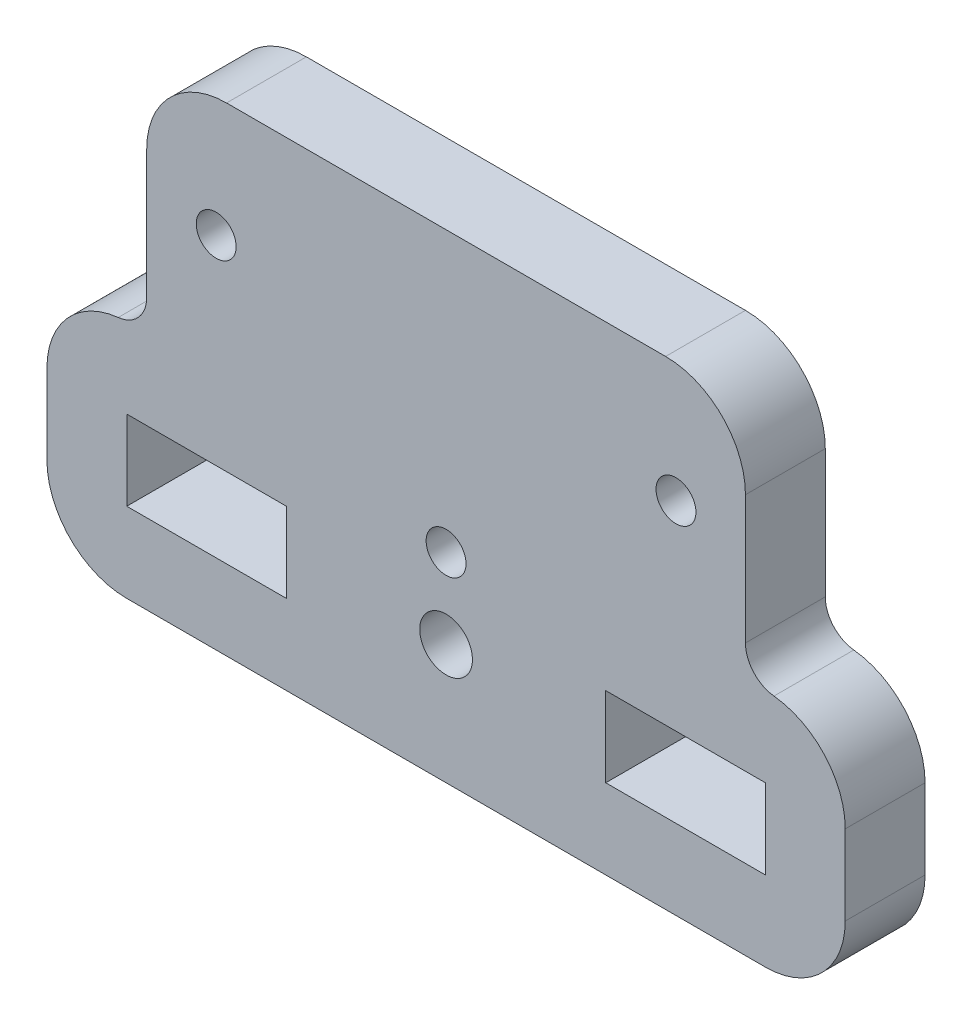
ISO-10303-21;
HEADER;
FILE_DESCRIPTION(('STEP AP214'),'2;1');
FILE_NAME('part.step','',(''),(''),'','','');
FILE_SCHEMA(('AUTOMOTIVE_DESIGN { 1 0 10303 214 1 1 1 1 }'));
ENDSEC;
DATA;
#1=APPLICATION_CONTEXT('core data for automotive mechanical design processes');
#2=APPLICATION_PROTOCOL_DEFINITION('international standard','automotive_design',2000,#1);
#3=PRODUCT_CONTEXT('',#1,'mechanical');
#4=PRODUCT('Part','Part','',(#3));
#5=PRODUCT_RELATED_PRODUCT_CATEGORY('part','',(#4));
#6=PRODUCT_DEFINITION_FORMATION('','',#4);
#7=PRODUCT_DEFINITION_CONTEXT('part definition',#1,'design');
#8=PRODUCT_DEFINITION('design','',#6,#7);
#9=PRODUCT_DEFINITION_SHAPE('','',#8);
#10=(LENGTH_UNIT() NAMED_UNIT(*) SI_UNIT(.MILLI.,.METRE.));
#11=(NAMED_UNIT(*) PLANE_ANGLE_UNIT() SI_UNIT($,.RADIAN.));
#12=(NAMED_UNIT(*) SI_UNIT($,.STERADIAN.) SOLID_ANGLE_UNIT());
#13=UNCERTAINTY_MEASURE_WITH_UNIT(LENGTH_MEASURE(1.E-05),#10,'distance_accuracy_value','');
#14=(GEOMETRIC_REPRESENTATION_CONTEXT(3) GLOBAL_UNCERTAINTY_ASSIGNED_CONTEXT((#13)) GLOBAL_UNIT_ASSIGNED_CONTEXT((#10,
#11,#12)) REPRESENTATION_CONTEXT('',''));
#15=CARTESIAN_POINT('',(0.,0.,0.));
#16=DIRECTION('',(0.,0.,1.));
#17=DIRECTION('',(1.,0.,0.));
#18=AXIS2_PLACEMENT_3D('',#15,#16,#17);
#19=CARTESIAN_POINT('',(0.,0.,6.35));
#20=DIRECTION('',(0.,0.,-1.));
#21=DIRECTION('',(-1.,0.,0.));
#22=AXIS2_PLACEMENT_3D('',#19,#20,#21);
#23=PLANE('',#22);
#24=CARTESIAN_POINT('',(0.,6.34999999999999,6.35));
#25=DIRECTION('',(0.,0.,1.));
#26=DIRECTION('',(1.,0.,0.));
#27=AXIS2_PLACEMENT_3D('',#24,#25,#26);
#28=CIRCLE('',#27,1.5875);
#29=CARTESIAN_POINT('',(1.5875,6.34999999999999,6.35));
#30=VERTEX_POINT('',#29);
#31=EDGE_CURVE('E687',#30,#30,#28,.T.);
#32=ORIENTED_EDGE('',*,*,#31,.F.);
#33=EDGE_LOOP('',(#32));
#34=FACE_BOUND('',#33,.T.);
#35=CARTESIAN_POINT('',(18.288,19.05,6.35));
#36=DIRECTION('',(0.,0.,-1.));
#37=DIRECTION('',(-1.,0.,0.));
#38=AXIS2_PLACEMENT_3D('',#35,#36,#37);
#39=CIRCLE('',#38,1.5875);
#40=CARTESIAN_POINT('',(16.7005,19.05,6.35));
#41=VERTEX_POINT('',#40);
#42=EDGE_CURVE('E689',#41,#41,#39,.T.);
#43=ORIENTED_EDGE('',*,*,#42,.T.);
#44=EDGE_LOOP('',(#43));
#45=FACE_BOUND('',#44,.T.);
#46=CARTESIAN_POINT('',(-18.288,19.05,6.35));
#47=DIRECTION('',(0.,0.,1.));
#48=DIRECTION('',(1.,0.,0.));
#49=AXIS2_PLACEMENT_3D('',#46,#47,#48);
#50=CIRCLE('',#49,1.5875);
#51=CARTESIAN_POINT('',(-16.7005,19.05,6.35));
#52=VERTEX_POINT('',#51);
#53=EDGE_CURVE('E694',#52,#52,#50,.T.);
#54=ORIENTED_EDGE('',*,*,#53,.F.);
#55=EDGE_LOOP('',(#54));
#56=FACE_BOUND('',#55,.T.);
#57=CARTESIAN_POINT('',(25.4,3.175,6.35));
#58=DIRECTION('',(0.,0.,-1.));
#59=DIRECTION('',(-1.,0.,0.));
#60=AXIS2_PLACEMENT_3D('',#57,#58,#59);
#61=CIRCLE('',#60,6.35);
#62=CARTESIAN_POINT('',(31.75,3.175,6.35));
#63=VERTEX_POINT('',#62);
#64=CARTESIAN_POINT('',(26.0803571428571,9.48844708999476,6.35));
#65=VERTEX_POINT('',#64);
#66=EDGE_CURVE('E366',#63,#65,#61,.F.);
#67=ORIENTED_EDGE('',*,*,#66,.T.);
#68=CARTESIAN_POINT('',(26.3525,12.0138259259927,6.35));
#69=DIRECTION('',(0.,0.,-1.));
#70=DIRECTION('',(-1.,0.,0.));
#71=AXIS2_PLACEMENT_3D('',#68,#69,#70);
#72=CIRCLE('',#71,2.54);
#73=CARTESIAN_POINT('',(23.8125,12.0138259259927,6.35));
#74=VERTEX_POINT('',#73);
#75=EDGE_CURVE('E301',#65,#74,#72,.T.);
#76=ORIENTED_EDGE('',*,*,#75,.T.);
#77=DIRECTION('',(0.,1.,0.));
#78=VECTOR('',#77,1.);
#79=CARTESIAN_POINT('',(23.8125,28.575,6.35));
#80=LINE('',#79,#78);
#81=CARTESIAN_POINT('',(23.8125,22.225,6.35));
#82=VERTEX_POINT('',#81);
#83=EDGE_CURVE('E288',#74,#82,#80,.T.);
#84=ORIENTED_EDGE('',*,*,#83,.T.);
#85=CARTESIAN_POINT('',(17.4625,22.225,6.35));
#86=DIRECTION('',(0.,0.,-1.));
#87=DIRECTION('',(-1.,0.,0.));
#88=AXIS2_PLACEMENT_3D('',#85,#86,#87);
#89=CIRCLE('',#88,6.35);
#90=CARTESIAN_POINT('',(17.4625,28.575,6.35));
#91=VERTEX_POINT('',#90);
#92=EDGE_CURVE('E376',#82,#91,#89,.F.);
#93=ORIENTED_EDGE('',*,*,#92,.T.);
#94=DIRECTION('',(-1.,0.,0.));
#95=VECTOR('',#94,1.);
#96=CARTESIAN_POINT('',(-23.8125,28.575,6.35));
#97=LINE('',#96,#95);
#98=CARTESIAN_POINT('',(-17.4625,28.575,6.35));
#99=VERTEX_POINT('',#98);
#100=EDGE_CURVE('E291',#91,#99,#97,.T.);
#101=ORIENTED_EDGE('',*,*,#100,.T.);
#102=CARTESIAN_POINT('',(-17.4625,22.225,6.35));
#103=DIRECTION('',(0.,0.,-1.));
#104=DIRECTION('',(-1.,0.,0.));
#105=AXIS2_PLACEMENT_3D('',#102,#103,#104);
#106=CIRCLE('',#105,6.35);
#107=CARTESIAN_POINT('',(-23.8125,22.225,6.35));
#108=VERTEX_POINT('',#107);
#109=EDGE_CURVE('E374',#99,#108,#106,.F.);
#110=ORIENTED_EDGE('',*,*,#109,.T.);
#111=DIRECTION('',(0.,-1.,0.));
#112=VECTOR('',#111,1.);
#113=CARTESIAN_POINT('',(-23.8125,28.575,6.35));
#114=LINE('',#113,#112);
#115=CARTESIAN_POINT('',(-23.8125,12.0138259259927,6.35));
#116=VERTEX_POINT('',#115);
#117=EDGE_CURVE('E362',#108,#116,#114,.T.);
#118=ORIENTED_EDGE('',*,*,#117,.T.);
#119=CARTESIAN_POINT('',(-26.3525,12.0138259259927,6.35));
#120=DIRECTION('',(0.,0.,-1.));
#121=DIRECTION('',(-1.,0.,0.));
#122=AXIS2_PLACEMENT_3D('',#119,#120,#121);
#123=CIRCLE('',#122,2.54);
#124=CARTESIAN_POINT('',(-26.0803571428571,9.48844708999476,6.35));
#125=VERTEX_POINT('',#124);
#126=EDGE_CURVE('E41',#116,#125,#123,.T.);
#127=ORIENTED_EDGE('',*,*,#126,.T.);
#128=CARTESIAN_POINT('',(-25.4,3.175,6.35));
#129=DIRECTION('',(0.,0.,-1.));
#130=DIRECTION('',(-1.,0.,0.));
#131=AXIS2_PLACEMENT_3D('',#128,#129,#130);
#132=CIRCLE('',#131,6.35);
#133=CARTESIAN_POINT('',(-31.75,3.175,6.35));
#134=VERTEX_POINT('',#133);
#135=EDGE_CURVE('E368',#125,#134,#132,.F.);
#136=ORIENTED_EDGE('',*,*,#135,.T.);
#137=DIRECTION('',(0.,-1.,0.));
#138=VECTOR('',#137,1.);
#139=CARTESIAN_POINT('',(-31.75,-9.525,6.35));
#140=LINE('',#139,#138);
#141=CARTESIAN_POINT('',(-31.75,-3.175,6.35));
#142=VERTEX_POINT('',#141);
#143=EDGE_CURVE('E268',#134,#142,#140,.T.);
#144=ORIENTED_EDGE('',*,*,#143,.T.);
#145=CARTESIAN_POINT('',(-25.4,-3.175,6.35));
#146=DIRECTION('',(0.,0.,-1.));
#147=DIRECTION('',(-1.,0.,0.));
#148=AXIS2_PLACEMENT_3D('',#145,#146,#147);
#149=CIRCLE('',#148,6.35);
#150=CARTESIAN_POINT('',(-25.4,-9.525,6.35));
#151=VERTEX_POINT('',#150);
#152=EDGE_CURVE('E370',#142,#151,#149,.F.);
#153=ORIENTED_EDGE('',*,*,#152,.T.);
#154=DIRECTION('',(1.,0.,0.));
#155=VECTOR('',#154,1.);
#156=CARTESIAN_POINT('',(-31.75,-9.525,6.35));
#157=LINE('',#156,#155);
#158=CARTESIAN_POINT('',(25.4,-9.525,6.35));
#159=VERTEX_POINT('',#158);
#160=EDGE_CURVE('E272',#151,#159,#157,.T.);
#161=ORIENTED_EDGE('',*,*,#160,.T.);
#162=CARTESIAN_POINT('',(25.4,-3.175,6.35));
#163=DIRECTION('',(0.,0.,-1.));
#164=DIRECTION('',(-1.,0.,0.));
#165=AXIS2_PLACEMENT_3D('',#162,#163,#164);
#166=CIRCLE('',#165,6.35);
#167=CARTESIAN_POINT('',(31.75,-3.175,6.35));
#168=VERTEX_POINT('',#167);
#169=EDGE_CURVE('E372',#159,#168,#166,.F.);
#170=ORIENTED_EDGE('',*,*,#169,.T.);
#171=DIRECTION('',(0.,1.,0.));
#172=VECTOR('',#171,1.);
#173=CARTESIAN_POINT('',(31.75,-9.525,6.35));
#174=LINE('',#173,#172);
#175=EDGE_CURVE('E265',#168,#63,#174,.T.);
#176=ORIENTED_EDGE('',*,*,#175,.T.);
#177=EDGE_LOOP('',(#67,#76,#84,#93,#101,#110,#118,#127,#136,#144,#153,#161,#170,#176));
#178=FACE_BOUND('',#177,.T.);
#179=CARTESIAN_POINT('',(0.,0.,6.35));
#180=DIRECTION('',(0.,0.,1.));
#181=DIRECTION('',(1.,0.,0.));
#182=AXIS2_PLACEMENT_3D('',#179,#180,#181);
#183=CIRCLE('',#182,2.0955);
#184=CARTESIAN_POINT('',(2.0955,0.,6.35));
#185=VERTEX_POINT('',#184);
#186=EDGE_CURVE('E252',#185,#185,#183,.T.);
#187=ORIENTED_EDGE('',*,*,#186,.F.);
#188=EDGE_LOOP('',(#187));
#189=FACE_BOUND('',#188,.T.);
#190=DIRECTION('',(-1.,0.,0.));
#191=VECTOR('',#190,1.);
#192=CARTESIAN_POINT('',(-25.4,3.17499999999999,6.35));
#193=LINE('',#192,#191);
#194=CARTESIAN_POINT('',(-12.7,3.17499999999999,6.35));
#195=VERTEX_POINT('',#194);
#196=CARTESIAN_POINT('',(-25.4,3.17499999999999,6.35));
#197=VERTEX_POINT('',#196);
#198=EDGE_CURVE('E242',#195,#197,#193,.T.);
#199=ORIENTED_EDGE('',*,*,#198,.F.);
#200=DIRECTION('',(0.,1.,0.));
#201=VECTOR('',#200,1.);
#202=CARTESIAN_POINT('',(-12.7,-3.17500000000001,6.35));
#203=LINE('',#202,#201);
#204=CARTESIAN_POINT('',(-12.7,-3.17500000000001,6.35));
#205=VERTEX_POINT('',#204);
#206=EDGE_CURVE('E223',#205,#195,#203,.T.);
#207=ORIENTED_EDGE('',*,*,#206,.F.);
#208=DIRECTION('',(1.,0.,0.));
#209=VECTOR('',#208,1.);
#210=CARTESIAN_POINT('',(-25.4,-3.17500000000001,6.35));
#211=LINE('',#210,#209);
#212=CARTESIAN_POINT('',(-25.4,-3.17500000000001,6.35));
#213=VERTEX_POINT('',#212);
#214=EDGE_CURVE('E231',#213,#205,#211,.T.);
#215=ORIENTED_EDGE('',*,*,#214,.F.);
#216=DIRECTION('',(0.,-1.,0.));
#217=VECTOR('',#216,1.);
#218=CARTESIAN_POINT('',(-25.4,-3.17500000000001,6.35));
#219=LINE('',#218,#217);
#220=EDGE_CURVE('E245',#197,#213,#219,.T.);
#221=ORIENTED_EDGE('',*,*,#220,.F.);
#222=EDGE_LOOP('',(#199,#207,#215,#221));
#223=FACE_BOUND('',#222,.T.);
#224=DIRECTION('',(0.,1.,0.));
#225=VECTOR('',#224,1.);
#226=CARTESIAN_POINT('',(12.7,-3.17500000000001,6.35));
#227=LINE('',#226,#225);
#228=CARTESIAN_POINT('',(12.7,-3.17500000000001,6.35));
#229=VERTEX_POINT('',#228);
#230=CARTESIAN_POINT('',(12.7,3.17499999999999,6.35));
#231=VERTEX_POINT('',#230);
#232=EDGE_CURVE('E199',#229,#231,#227,.T.);
#233=ORIENTED_EDGE('',*,*,#232,.T.);
#234=DIRECTION('',(1.,0.,0.));
#235=VECTOR('',#234,1.);
#236=CARTESIAN_POINT('',(25.4,3.17499999999999,6.35));
#237=LINE('',#236,#235);
#238=CARTESIAN_POINT('',(25.4,3.17499999999999,6.35));
#239=VERTEX_POINT('',#238);
#240=EDGE_CURVE('E204',#231,#239,#237,.T.);
#241=ORIENTED_EDGE('',*,*,#240,.T.);
#242=DIRECTION('',(0.,-1.,0.));
#243=VECTOR('',#242,1.);
#244=CARTESIAN_POINT('',(25.4,-3.17500000000001,6.35));
#245=LINE('',#244,#243);
#246=CARTESIAN_POINT('',(25.4,-3.17500000000001,6.35));
#247=VERTEX_POINT('',#246);
#248=EDGE_CURVE('E207',#239,#247,#245,.T.);
#249=ORIENTED_EDGE('',*,*,#248,.T.);
#250=DIRECTION('',(-1.,0.,0.));
#251=VECTOR('',#250,1.);
#252=CARTESIAN_POINT('',(25.4,-3.17500000000001,6.35));
#253=LINE('',#252,#251);
#254=EDGE_CURVE('E216',#247,#229,#253,.T.);
#255=ORIENTED_EDGE('',*,*,#254,.T.);
#256=EDGE_LOOP('',(#233,#241,#249,#255));
#257=FACE_BOUND('',#256,.T.);
#258=ADVANCED_FACE('F33',(#34,#45,#56,#178,#189,#223,#257),#23,.F.);
#259=CARTESIAN_POINT('',(0.,0.,0.));
#260=DIRECTION('',(0.,0.,-1.));
#261=DIRECTION('',(-1.,0.,0.));
#262=AXIS2_PLACEMENT_3D('',#259,#260,#261);
#263=PLANE('',#262);
#264=CARTESIAN_POINT('',(0.,6.34999999999999,0.));
#265=DIRECTION('',(0.,0.,-1.));
#266=DIRECTION('',(-1.,0.,0.));
#267=AXIS2_PLACEMENT_3D('',#264,#265,#266);
#268=CIRCLE('',#267,1.5875);
#269=CARTESIAN_POINT('',(-1.5875,6.34999999999999,0.));
#270=VERTEX_POINT('',#269);
#271=EDGE_CURVE('E685',#270,#270,#268,.T.);
#272=ORIENTED_EDGE('',*,*,#271,.F.);
#273=EDGE_LOOP('',(#272));
#274=FACE_BOUND('',#273,.T.);
#275=CARTESIAN_POINT('',(18.288,19.05,0.));
#276=DIRECTION('',(0.,0.,-1.));
#277=DIRECTION('',(-1.,0.,0.));
#278=AXIS2_PLACEMENT_3D('',#275,#276,#277);
#279=CIRCLE('',#278,1.5875);
#280=CARTESIAN_POINT('',(16.7005,19.05,0.));
#281=VERTEX_POINT('',#280);
#282=EDGE_CURVE('E693',#281,#281,#279,.F.);
#283=ORIENTED_EDGE('',*,*,#282,.T.);
#284=EDGE_LOOP('',(#283));
#285=FACE_BOUND('',#284,.T.);
#286=CARTESIAN_POINT('',(-18.288,19.05,0.));
#287=DIRECTION('',(0.,0.,-1.));
#288=DIRECTION('',(-1.,0.,0.));
#289=AXIS2_PLACEMENT_3D('',#286,#287,#288);
#290=CIRCLE('',#289,1.5875);
#291=CARTESIAN_POINT('',(-19.8755,19.05,0.));
#292=VERTEX_POINT('',#291);
#293=EDGE_CURVE('E292',#292,#292,#290,.T.);
#294=ORIENTED_EDGE('',*,*,#293,.F.);
#295=EDGE_LOOP('',(#294));
#296=FACE_BOUND('',#295,.T.);
#297=DIRECTION('',(0.,1.,0.));
#298=VECTOR('',#297,1.);
#299=CARTESIAN_POINT('',(-12.7,-3.17500000000001,0.));
#300=LINE('',#299,#298);
#301=CARTESIAN_POINT('',(-12.7,-3.17500000000001,0.));
#302=VERTEX_POINT('',#301);
#303=CARTESIAN_POINT('',(-12.7,3.17499999999999,0.));
#304=VERTEX_POINT('',#303);
#305=EDGE_CURVE('E227',#302,#304,#300,.T.);
#306=ORIENTED_EDGE('',*,*,#305,.T.);
#307=DIRECTION('',(-1.,0.,0.));
#308=VECTOR('',#307,1.);
#309=CARTESIAN_POINT('',(-25.4,3.17499999999999,0.));
#310=LINE('',#309,#308);
#311=CARTESIAN_POINT('',(-25.4,3.17499999999999,0.));
#312=VERTEX_POINT('',#311);
#313=EDGE_CURVE('E230',#304,#312,#310,.T.);
#314=ORIENTED_EDGE('',*,*,#313,.T.);
#315=DIRECTION('',(0.,-1.,0.));
#316=VECTOR('',#315,1.);
#317=CARTESIAN_POINT('',(-25.4,-3.17500000000001,0.));
#318=LINE('',#317,#316);
#319=CARTESIAN_POINT('',(-25.4,-3.17500000000001,0.));
#320=VERTEX_POINT('',#319);
#321=EDGE_CURVE('E234',#312,#320,#318,.T.);
#322=ORIENTED_EDGE('',*,*,#321,.T.);
#323=DIRECTION('',(1.,0.,0.));
#324=VECTOR('',#323,1.);
#325=CARTESIAN_POINT('',(-25.4,-3.17500000000001,0.));
#326=LINE('',#325,#324);
#327=EDGE_CURVE('E237',#320,#302,#326,.T.);
#328=ORIENTED_EDGE('',*,*,#327,.T.);
#329=EDGE_LOOP('',(#306,#314,#322,#328));
#330=FACE_BOUND('',#329,.T.);
#331=CARTESIAN_POINT('',(0.,0.,0.));
#332=DIRECTION('',(0.,0.,1.));
#333=DIRECTION('',(1.,0.,0.));
#334=AXIS2_PLACEMENT_3D('',#331,#332,#333);
#335=CIRCLE('',#334,2.0955);
#336=CARTESIAN_POINT('',(2.0955,0.,0.));
#337=VERTEX_POINT('',#336);
#338=EDGE_CURVE('E259',#337,#337,#335,.T.);
#339=ORIENTED_EDGE('',*,*,#338,.T.);
#340=EDGE_LOOP('',(#339));
#341=FACE_BOUND('',#340,.T.);
#342=DIRECTION('',(-1.,0.,0.));
#343=VECTOR('',#342,1.);
#344=CARTESIAN_POINT('',(-23.8125,28.575,0.));
#345=LINE('',#344,#343);
#346=CARTESIAN_POINT('',(17.4625,28.575,0.));
#347=VERTEX_POINT('',#346);
#348=CARTESIAN_POINT('',(-17.4625,28.575,0.));
#349=VERTEX_POINT('',#348);
#350=EDGE_CURVE('E210',#347,#349,#345,.T.);
#351=ORIENTED_EDGE('',*,*,#350,.F.);
#352=CARTESIAN_POINT('',(17.4625,22.225,0.));
#353=DIRECTION('',(0.,0.,-1.));
#354=DIRECTION('',(-1.,0.,0.));
#355=AXIS2_PLACEMENT_3D('',#352,#353,#354);
#356=CIRCLE('',#355,6.35);
#357=CARTESIAN_POINT('',(23.8125,22.225,0.));
#358=VERTEX_POINT('',#357);
#359=EDGE_CURVE('E343',#347,#358,#356,.T.);
#360=ORIENTED_EDGE('',*,*,#359,.T.);
#361=DIRECTION('',(0.,1.,0.));
#362=VECTOR('',#361,1.);
#363=CARTESIAN_POINT('',(23.8125,28.575,0.));
#364=LINE('',#363,#362);
#365=CARTESIAN_POINT('',(23.8125,12.0138259259927,0.));
#366=VERTEX_POINT('',#365);
#367=EDGE_CURVE('E217',#366,#358,#364,.T.);
#368=ORIENTED_EDGE('',*,*,#367,.F.);
#369=CARTESIAN_POINT('',(26.3525,12.0138259259927,0.));
#370=DIRECTION('',(0.,0.,-1.));
#371=DIRECTION('',(-1.,0.,0.));
#372=AXIS2_PLACEMENT_3D('',#369,#370,#371);
#373=CIRCLE('',#372,2.54);
#374=CARTESIAN_POINT('',(26.0803571428571,9.48844708999476,0.));
#375=VERTEX_POINT('',#374);
#376=EDGE_CURVE('E303',#366,#375,#373,.F.);
#377=ORIENTED_EDGE('',*,*,#376,.T.);
#378=CARTESIAN_POINT('',(25.4,3.175,0.));
#379=DIRECTION('',(0.,0.,-1.));
#380=DIRECTION('',(-1.,0.,0.));
#381=AXIS2_PLACEMENT_3D('',#378,#379,#380);
#382=CIRCLE('',#381,6.35);
#383=CARTESIAN_POINT('',(31.75,3.175,0.));
#384=VERTEX_POINT('',#383);
#385=EDGE_CURVE('E310',#375,#384,#382,.T.);
#386=ORIENTED_EDGE('',*,*,#385,.T.);
#387=DIRECTION('',(0.,1.,0.));
#388=VECTOR('',#387,1.);
#389=CARTESIAN_POINT('',(31.75,-9.525,0.));
#390=LINE('',#389,#388);
#391=CARTESIAN_POINT('',(31.75,-3.175,0.));
#392=VERTEX_POINT('',#391);
#393=EDGE_CURVE('E262',#392,#384,#390,.T.);
#394=ORIENTED_EDGE('',*,*,#393,.F.);
#395=CARTESIAN_POINT('',(25.4,-3.175,0.));
#396=DIRECTION('',(0.,0.,-1.));
#397=DIRECTION('',(-1.,0.,0.));
#398=AXIS2_PLACEMENT_3D('',#395,#396,#397);
#399=CIRCLE('',#398,6.35);
#400=CARTESIAN_POINT('',(25.4,-9.525,0.));
#401=VERTEX_POINT('',#400);
#402=EDGE_CURVE('E347',#392,#401,#399,.T.);
#403=ORIENTED_EDGE('',*,*,#402,.T.);
#404=DIRECTION('',(1.,0.,0.));
#405=VECTOR('',#404,1.);
#406=CARTESIAN_POINT('',(-31.75,-9.525,0.));
#407=LINE('',#406,#405);
#408=CARTESIAN_POINT('',(-25.4,-9.525,0.));
#409=VERTEX_POINT('',#408);
#410=EDGE_CURVE('E269',#409,#401,#407,.T.);
#411=ORIENTED_EDGE('',*,*,#410,.F.);
#412=CARTESIAN_POINT('',(-25.4,-3.175,0.));
#413=DIRECTION('',(0.,0.,-1.));
#414=DIRECTION('',(-1.,0.,0.));
#415=AXIS2_PLACEMENT_3D('',#412,#413,#414);
#416=CIRCLE('',#415,6.35);
#417=CARTESIAN_POINT('',(-31.75,-3.175,0.));
#418=VERTEX_POINT('',#417);
#419=EDGE_CURVE('E349',#409,#418,#416,.T.);
#420=ORIENTED_EDGE('',*,*,#419,.T.);
#421=DIRECTION('',(0.,-1.,0.));
#422=VECTOR('',#421,1.);
#423=CARTESIAN_POINT('',(-31.75,-9.525,0.));
#424=LINE('',#423,#422);
#425=CARTESIAN_POINT('',(-31.75,3.175,0.));
#426=VERTEX_POINT('',#425);
#427=EDGE_CURVE('E278',#426,#418,#424,.T.);
#428=ORIENTED_EDGE('',*,*,#427,.F.);
#429=CARTESIAN_POINT('',(-25.4,3.175,0.));
#430=DIRECTION('',(0.,0.,-1.));
#431=DIRECTION('',(-1.,0.,0.));
#432=AXIS2_PLACEMENT_3D('',#429,#430,#431);
#433=CIRCLE('',#432,6.35);
#434=CARTESIAN_POINT('',(-26.0803571428571,9.48844708999476,0.));
#435=VERTEX_POINT('',#434);
#436=EDGE_CURVE('E322',#426,#435,#433,.T.);
#437=ORIENTED_EDGE('',*,*,#436,.T.);
#438=CARTESIAN_POINT('',(-26.3525,12.0138259259927,0.));
#439=DIRECTION('',(0.,0.,-1.));
#440=DIRECTION('',(-1.,0.,0.));
#441=AXIS2_PLACEMENT_3D('',#438,#439,#440);
#442=CIRCLE('',#441,2.54);
#443=CARTESIAN_POINT('',(-23.8125,12.0138259259927,0.));
#444=VERTEX_POINT('',#443);
#445=EDGE_CURVE('E11',#435,#444,#442,.F.);
#446=ORIENTED_EDGE('',*,*,#445,.T.);
#447=DIRECTION('',(0.,-1.,0.));
#448=VECTOR('',#447,1.);
#449=CARTESIAN_POINT('',(-23.8125,28.575,0.));
#450=LINE('',#449,#448);
#451=CARTESIAN_POINT('',(-23.8125,22.225,0.));
#452=VERTEX_POINT('',#451);
#453=EDGE_CURVE('E352',#452,#444,#450,.T.);
#454=ORIENTED_EDGE('',*,*,#453,.F.);
#455=CARTESIAN_POINT('',(-17.4625,22.225,0.));
#456=DIRECTION('',(0.,0.,-1.));
#457=DIRECTION('',(-1.,0.,0.));
#458=AXIS2_PLACEMENT_3D('',#455,#456,#457);
#459=CIRCLE('',#458,6.35);
#460=EDGE_CURVE('E345',#452,#349,#459,.T.);
#461=ORIENTED_EDGE('',*,*,#460,.T.);
#462=EDGE_LOOP('',(#351,#360,#368,#377,#386,#394,#403,#411,#420,#428,#437,#446,#454,#461));
#463=FACE_BOUND('',#462,.T.);
#464=DIRECTION('',(1.,0.,0.));
#465=VECTOR('',#464,1.);
#466=CARTESIAN_POINT('',(25.4,3.17499999999999,0.));
#467=LINE('',#466,#465);
#468=CARTESIAN_POINT('',(12.7,3.17499999999999,0.));
#469=VERTEX_POINT('',#468);
#470=CARTESIAN_POINT('',(25.4,3.17499999999999,0.));
#471=VERTEX_POINT('',#470);
#472=EDGE_CURVE('E200',#469,#471,#467,.T.);
#473=ORIENTED_EDGE('',*,*,#472,.F.);
#474=DIRECTION('',(0.,1.,0.));
#475=VECTOR('',#474,1.);
#476=CARTESIAN_POINT('',(12.7,-3.17500000000001,0.));
#477=LINE('',#476,#475);
#478=CARTESIAN_POINT('',(12.7,-3.17500000000001,0.));
#479=VERTEX_POINT('',#478);
#480=EDGE_CURVE('E192',#479,#469,#477,.T.);
#481=ORIENTED_EDGE('',*,*,#480,.F.);
#482=DIRECTION('',(-1.,0.,0.));
#483=VECTOR('',#482,1.);
#484=CARTESIAN_POINT('',(25.4,-3.17500000000001,0.));
#485=LINE('',#484,#483);
#486=CARTESIAN_POINT('',(25.4,-3.17500000000001,0.));
#487=VERTEX_POINT('',#486);
#488=EDGE_CURVE('E180',#487,#479,#485,.T.);
#489=ORIENTED_EDGE('',*,*,#488,.F.);
#490=DIRECTION('',(0.,-1.,0.));
#491=VECTOR('',#490,1.);
#492=CARTESIAN_POINT('',(25.4,-3.17500000000001,0.));
#493=LINE('',#492,#491);
#494=EDGE_CURVE('E191',#471,#487,#493,.T.);
#495=ORIENTED_EDGE('',*,*,#494,.F.);
#496=EDGE_LOOP('',(#473,#481,#489,#495));
#497=FACE_BOUND('',#496,.T.);
#498=ADVANCED_FACE('F203',(#274,#285,#296,#330,#341,#463,#497),#263,.T.);
#499=CARTESIAN_POINT('',(31.75,-9.525,6.35));
#500=DIRECTION('',(-1.,0.,0.));
#501=DIRECTION('',(0.,0.,1.));
#502=AXIS2_PLACEMENT_3D('',#499,#500,#501);
#503=PLANE('',#502);
#504=ORIENTED_EDGE('',*,*,#175,.F.);
#505=DIRECTION('',(0.,0.,-1.));
#506=VECTOR('',#505,1.);
#507=CARTESIAN_POINT('',(31.75,-3.175,6.35));
#508=LINE('',#507,#506);
#509=EDGE_CURVE('E337',#168,#392,#508,.T.);
#510=ORIENTED_EDGE('',*,*,#509,.T.);
#511=ORIENTED_EDGE('',*,*,#393,.T.);
#512=DIRECTION('',(0.,0.,-1.));
#513=VECTOR('',#512,1.);
#514=CARTESIAN_POINT('',(31.75,3.175,6.35));
#515=LINE('',#514,#513);
#516=EDGE_CURVE('E321',#384,#63,#515,.F.);
#517=ORIENTED_EDGE('',*,*,#516,.T.);
#518=EDGE_LOOP('',(#504,#510,#511,#517));
#519=FACE_BOUND('',#518,.T.);
#520=ADVANCED_FACE('F402',(#519),#503,.F.);
#521=CARTESIAN_POINT('',(-31.75,-9.525,6.35));
#522=DIRECTION('',(1.,0.,0.));
#523=DIRECTION('',(0.,0.,-1.));
#524=AXIS2_PLACEMENT_3D('',#521,#522,#523);
#525=PLANE('',#524);
#526=ORIENTED_EDGE('',*,*,#427,.T.);
#527=DIRECTION('',(0.,0.,-1.));
#528=VECTOR('',#527,1.);
#529=CARTESIAN_POINT('',(-31.75,-3.175,6.35));
#530=LINE('',#529,#528);
#531=EDGE_CURVE('E326',#418,#142,#530,.F.);
#532=ORIENTED_EDGE('',*,*,#531,.T.);
#533=ORIENTED_EDGE('',*,*,#143,.F.);
#534=DIRECTION('',(0.,0.,-1.));
#535=VECTOR('',#534,1.);
#536=CARTESIAN_POINT('',(-31.75,3.175,6.35));
#537=LINE('',#536,#535);
#538=EDGE_CURVE('E327',#134,#426,#537,.T.);
#539=ORIENTED_EDGE('',*,*,#538,.T.);
#540=EDGE_LOOP('',(#526,#532,#533,#539));
#541=FACE_BOUND('',#540,.T.);
#542=ADVANCED_FACE('F417',(#541),#525,.F.);
#543=CARTESIAN_POINT('',(-31.75,-9.525,6.35));
#544=DIRECTION('',(0.,1.,0.));
#545=DIRECTION('',(0.,0.,1.));
#546=AXIS2_PLACEMENT_3D('',#543,#544,#545);
#547=PLANE('',#546);
#548=ORIENTED_EDGE('',*,*,#410,.T.);
#549=DIRECTION('',(0.,0.,-1.));
#550=VECTOR('',#549,1.);
#551=CARTESIAN_POINT('',(25.4,-9.525,6.35));
#552=LINE('',#551,#550);
#553=EDGE_CURVE('E332',#401,#159,#552,.F.);
#554=ORIENTED_EDGE('',*,*,#553,.T.);
#555=ORIENTED_EDGE('',*,*,#160,.F.);
#556=DIRECTION('',(0.,0.,-1.));
#557=VECTOR('',#556,1.);
#558=CARTESIAN_POINT('',(-25.4,-9.525,6.35));
#559=LINE('',#558,#557);
#560=EDGE_CURVE('E334',#151,#409,#559,.T.);
#561=ORIENTED_EDGE('',*,*,#560,.T.);
#562=EDGE_LOOP('',(#548,#554,#555,#561));
#563=FACE_BOUND('',#562,.T.);
#564=ADVANCED_FACE('F408',(#563),#547,.F.);
#565=CARTESIAN_POINT('',(0.,0.,0.));
#566=DIRECTION('',(0.,0.,1.));
#567=DIRECTION('',(1.,0.,0.));
#568=AXIS2_PLACEMENT_3D('',#565,#566,#567);
#569=CYLINDRICAL_SURFACE('',#568,2.0955);
#570=ORIENTED_EDGE('',*,*,#338,.F.);
#571=EDGE_LOOP('',(#570));
#572=FACE_BOUND('',#571,.T.);
#573=ORIENTED_EDGE('',*,*,#186,.T.);
#574=EDGE_LOOP('',(#573));
#575=FACE_BOUND('',#574,.T.);
#576=ADVANCED_FACE('F450',(#572,#575),#569,.F.);
#577=CARTESIAN_POINT('',(-12.7,-3.17500000000001,0.));
#578=DIRECTION('',(1.,0.,0.));
#579=DIRECTION('',(0.,0.,-1.));
#580=AXIS2_PLACEMENT_3D('',#577,#578,#579);
#581=PLANE('',#580);
#582=ORIENTED_EDGE('',*,*,#206,.T.);
#583=DIRECTION('',(0.,0.,1.));
#584=VECTOR('',#583,1.);
#585=CARTESIAN_POINT('',(-12.7,3.17499999999999,0.));
#586=LINE('',#585,#584);
#587=EDGE_CURVE('E240',#304,#195,#586,.T.);
#588=ORIENTED_EDGE('',*,*,#587,.F.);
#589=ORIENTED_EDGE('',*,*,#305,.F.);
#590=DIRECTION('',(0.,0.,1.));
#591=VECTOR('',#590,1.);
#592=CARTESIAN_POINT('',(-12.7,-3.17500000000001,0.));
#593=LINE('',#592,#591);
#594=EDGE_CURVE('E250',#302,#205,#593,.T.);
#595=ORIENTED_EDGE('',*,*,#594,.T.);
#596=EDGE_LOOP('',(#582,#588,#589,#595));
#597=FACE_BOUND('',#596,.T.);
#598=ADVANCED_FACE('F478',(#597),#581,.F.);
#599=CARTESIAN_POINT('',(-25.4,-3.17500000000001,0.));
#600=DIRECTION('',(0.,-1.,0.));
#601=DIRECTION('',(0.,0.,-1.));
#602=AXIS2_PLACEMENT_3D('',#599,#600,#601);
#603=PLANE('',#602);
#604=ORIENTED_EDGE('',*,*,#214,.T.);
#605=ORIENTED_EDGE('',*,*,#594,.F.);
#606=ORIENTED_EDGE('',*,*,#327,.F.);
#607=DIRECTION('',(0.,0.,1.));
#608=VECTOR('',#607,1.);
#609=CARTESIAN_POINT('',(-25.4,-3.17500000000001,0.));
#610=LINE('',#609,#608);
#611=EDGE_CURVE('E253',#320,#213,#610,.T.);
#612=ORIENTED_EDGE('',*,*,#611,.T.);
#613=EDGE_LOOP('',(#604,#605,#606,#612));
#614=FACE_BOUND('',#613,.T.);
#615=ADVANCED_FACE('F485',(#614),#603,.F.);
#616=CARTESIAN_POINT('',(-25.4,-3.17500000000001,0.));
#617=DIRECTION('',(-1.,0.,0.));
#618=DIRECTION('',(0.,0.,1.));
#619=AXIS2_PLACEMENT_3D('',#616,#617,#618);
#620=PLANE('',#619);
#621=ORIENTED_EDGE('',*,*,#220,.T.);
#622=ORIENTED_EDGE('',*,*,#611,.F.);
#623=ORIENTED_EDGE('',*,*,#321,.F.);
#624=DIRECTION('',(0.,0.,1.));
#625=VECTOR('',#624,1.);
#626=CARTESIAN_POINT('',(-25.4,3.17499999999999,0.));
#627=LINE('',#626,#625);
#628=EDGE_CURVE('E255',#312,#197,#627,.T.);
#629=ORIENTED_EDGE('',*,*,#628,.T.);
#630=EDGE_LOOP('',(#621,#622,#623,#629));
#631=FACE_BOUND('',#630,.T.);
#632=ADVANCED_FACE('F492',(#631),#620,.F.);
#633=CARTESIAN_POINT('',(-25.4,3.17499999999999,0.));
#634=DIRECTION('',(0.,1.,0.));
#635=DIRECTION('',(0.,0.,1.));
#636=AXIS2_PLACEMENT_3D('',#633,#634,#635);
#637=PLANE('',#636);
#638=ORIENTED_EDGE('',*,*,#198,.T.);
#639=ORIENTED_EDGE('',*,*,#628,.F.);
#640=ORIENTED_EDGE('',*,*,#313,.F.);
#641=ORIENTED_EDGE('',*,*,#587,.T.);
#642=EDGE_LOOP('',(#638,#639,#640,#641));
#643=FACE_BOUND('',#642,.T.);
#644=ADVANCED_FACE('F500',(#643),#637,.F.);
#645=CARTESIAN_POINT('',(12.7,-3.17500000000001,0.));
#646=DIRECTION('',(1.,0.,0.));
#647=DIRECTION('',(0.,0.,-1.));
#648=AXIS2_PLACEMENT_3D('',#645,#646,#647);
#649=PLANE('',#648);
#650=ORIENTED_EDGE('',*,*,#232,.F.);
#651=DIRECTION('',(0.,0.,1.));
#652=VECTOR('',#651,1.);
#653=CARTESIAN_POINT('',(12.7,-3.17500000000001,0.));
#654=LINE('',#653,#652);
#655=EDGE_CURVE('E184',#479,#229,#654,.T.);
#656=ORIENTED_EDGE('',*,*,#655,.F.);
#657=ORIENTED_EDGE('',*,*,#480,.T.);
#658=DIRECTION('',(0.,0.,1.));
#659=VECTOR('',#658,1.);
#660=CARTESIAN_POINT('',(12.7,3.17499999999999,0.));
#661=LINE('',#660,#659);
#662=EDGE_CURVE('E221',#469,#231,#661,.T.);
#663=ORIENTED_EDGE('',*,*,#662,.T.);
#664=EDGE_LOOP('',(#650,#656,#657,#663));
#665=FACE_BOUND('',#664,.T.);
#666=ADVANCED_FACE('F195',(#665),#649,.T.);
#667=CARTESIAN_POINT('',(25.4,3.17499999999999,0.));
#668=DIRECTION('',(0.,-1.,0.));
#669=DIRECTION('',(0.,0.,-1.));
#670=AXIS2_PLACEMENT_3D('',#667,#668,#669);
#671=PLANE('',#670);
#672=ORIENTED_EDGE('',*,*,#240,.F.);
#673=ORIENTED_EDGE('',*,*,#662,.F.);
#674=ORIENTED_EDGE('',*,*,#472,.T.);
#675=DIRECTION('',(0.,0.,1.));
#676=VECTOR('',#675,1.);
#677=CARTESIAN_POINT('',(25.4,3.17499999999999,0.));
#678=LINE('',#677,#676);
#679=EDGE_CURVE('E224',#471,#239,#678,.T.);
#680=ORIENTED_EDGE('',*,*,#679,.T.);
#681=EDGE_LOOP('',(#672,#673,#674,#680));
#682=FACE_BOUND('',#681,.T.);
#683=ADVANCED_FACE('F515',(#682),#671,.T.);
#684=CARTESIAN_POINT('',(25.4,-3.17500000000001,0.));
#685=DIRECTION('',(-1.,0.,0.));
#686=DIRECTION('',(0.,0.,1.));
#687=AXIS2_PLACEMENT_3D('',#684,#685,#686);
#688=PLANE('',#687);
#689=ORIENTED_EDGE('',*,*,#248,.F.);
#690=ORIENTED_EDGE('',*,*,#679,.F.);
#691=ORIENTED_EDGE('',*,*,#494,.T.);
#692=DIRECTION('',(0.,0.,1.));
#693=VECTOR('',#692,1.);
#694=CARTESIAN_POINT('',(25.4,-3.17500000000001,0.));
#695=LINE('',#694,#693);
#696=EDGE_CURVE('E186',#487,#247,#695,.T.);
#697=ORIENTED_EDGE('',*,*,#696,.T.);
#698=EDGE_LOOP('',(#689,#690,#691,#697));
#699=FACE_BOUND('',#698,.T.);
#700=ADVANCED_FACE('F522',(#699),#688,.T.);
#701=CARTESIAN_POINT('',(25.4,-3.17500000000001,0.));
#702=DIRECTION('',(0.,1.,0.));
#703=DIRECTION('',(0.,0.,1.));
#704=AXIS2_PLACEMENT_3D('',#701,#702,#703);
#705=PLANE('',#704);
#706=ORIENTED_EDGE('',*,*,#254,.F.);
#707=ORIENTED_EDGE('',*,*,#696,.F.);
#708=ORIENTED_EDGE('',*,*,#488,.T.);
#709=ORIENTED_EDGE('',*,*,#655,.T.);
#710=EDGE_LOOP('',(#706,#707,#708,#709));
#711=FACE_BOUND('',#710,.T.);
#712=ADVANCED_FACE('F183',(#711),#705,.T.);
#713=CARTESIAN_POINT('',(-23.8125,28.575,-51.2936947879562));
#714=DIRECTION('',(0.,1.,0.));
#715=DIRECTION('',(0.,0.,1.));
#716=AXIS2_PLACEMENT_3D('',#713,#714,#715);
#717=PLANE('',#716);
#718=ORIENTED_EDGE('',*,*,#100,.F.);
#719=DIRECTION('',(0.,0.,1.));
#720=VECTOR('',#719,1.);
#721=CARTESIAN_POINT('',(17.4625,28.575,-51.2936947879562));
#722=LINE('',#721,#720);
#723=EDGE_CURVE('E323',#91,#347,#722,.F.);
#724=ORIENTED_EDGE('',*,*,#723,.T.);
#725=ORIENTED_EDGE('',*,*,#350,.T.);
#726=DIRECTION('',(0.,0.,1.));
#727=VECTOR('',#726,1.);
#728=CARTESIAN_POINT('',(-17.4625,28.575,-51.2936947879562));
#729=LINE('',#728,#727);
#730=EDGE_CURVE('E377',#349,#99,#729,.T.);
#731=ORIENTED_EDGE('',*,*,#730,.T.);
#732=EDGE_LOOP('',(#718,#724,#725,#731));
#733=FACE_BOUND('',#732,.T.);
#734=ADVANCED_FACE('F385',(#733),#717,.T.);
#735=CARTESIAN_POINT('',(-23.8125,28.575,-51.2936947879562));
#736=DIRECTION('',(-1.,0.,0.));
#737=DIRECTION('',(0.,-1.,0.));
#738=AXIS2_PLACEMENT_3D('',#735,#736,#737);
#739=PLANE('',#738);
#740=ORIENTED_EDGE('',*,*,#453,.T.);
#741=DIRECTION('',(0.,0.,1.));
#742=VECTOR('',#741,1.);
#743=CARTESIAN_POINT('',(-23.8125,12.0138259259927,6.35));
#744=LINE('',#743,#742);
#745=EDGE_CURVE('E296',#444,#116,#744,.T.);
#746=ORIENTED_EDGE('',*,*,#745,.T.);
#747=ORIENTED_EDGE('',*,*,#117,.F.);
#748=DIRECTION('',(0.,0.,1.));
#749=VECTOR('',#748,1.);
#750=CARTESIAN_POINT('',(-23.8125,22.225,-51.2936947879562));
#751=LINE('',#750,#749);
#752=EDGE_CURVE('E341',#108,#452,#751,.F.);
#753=ORIENTED_EDGE('',*,*,#752,.T.);
#754=EDGE_LOOP('',(#740,#746,#747,#753));
#755=FACE_BOUND('',#754,.T.);
#756=ADVANCED_FACE('F426',(#755),#739,.T.);
#757=CARTESIAN_POINT('',(23.8125,28.575,-51.2936947879562));
#758=DIRECTION('',(1.,0.,0.));
#759=DIRECTION('',(0.,1.,0.));
#760=AXIS2_PLACEMENT_3D('',#757,#758,#759);
#761=PLANE('',#760);
#762=ORIENTED_EDGE('',*,*,#83,.F.);
#763=DIRECTION('',(0.,0.,1.));
#764=VECTOR('',#763,1.);
#765=CARTESIAN_POINT('',(23.8125,12.0138259259927,0.));
#766=LINE('',#765,#764);
#767=EDGE_CURVE('E294',#74,#366,#766,.F.);
#768=ORIENTED_EDGE('',*,*,#767,.T.);
#769=ORIENTED_EDGE('',*,*,#367,.T.);
#770=DIRECTION('',(0.,0.,1.));
#771=VECTOR('',#770,1.);
#772=CARTESIAN_POINT('',(23.8125,22.225,-51.2936947879562));
#773=LINE('',#772,#771);
#774=EDGE_CURVE('E275',#358,#82,#773,.T.);
#775=ORIENTED_EDGE('',*,*,#774,.T.);
#776=EDGE_LOOP('',(#762,#768,#769,#775));
#777=FACE_BOUND('',#776,.T.);
#778=ADVANCED_FACE('F396',(#777),#761,.T.);
#779=CARTESIAN_POINT('',(-18.288,19.05,-4.99999999997031E-05));
#780=DIRECTION('',(0.,0.,1.));
#781=DIRECTION('',(1.,0.,0.));
#782=AXIS2_PLACEMENT_3D('',#779,#780,#781);
#783=CYLINDRICAL_SURFACE('',#782,1.5875);
#784=ORIENTED_EDGE('',*,*,#293,.T.);
#785=EDGE_LOOP('',(#784));
#786=FACE_BOUND('',#785,.T.);
#787=ORIENTED_EDGE('',*,*,#53,.T.);
#788=EDGE_LOOP('',(#787));
#789=FACE_BOUND('',#788,.T.);
#790=ADVANCED_FACE('F556',(#786,#789),#783,.F.);
#791=CARTESIAN_POINT('',(18.288,19.05,-4.99999999997031E-05));
#792=DIRECTION('',(0.,0.,1.));
#793=DIRECTION('',(1.,0.,0.));
#794=AXIS2_PLACEMENT_3D('',#791,#792,#793);
#795=CYLINDRICAL_SURFACE('',#794,1.5875);
#796=ORIENTED_EDGE('',*,*,#282,.F.);
#797=EDGE_LOOP('',(#796));
#798=FACE_BOUND('',#797,.T.);
#799=ORIENTED_EDGE('',*,*,#42,.F.);
#800=EDGE_LOOP('',(#799));
#801=FACE_BOUND('',#800,.T.);
#802=ADVANCED_FACE('F563',(#798,#801),#795,.F.);
#803=CARTESIAN_POINT('',(0.,6.34999999999999,-4.99999999997031E-05));
#804=DIRECTION('',(0.,0.,1.));
#805=DIRECTION('',(1.,0.,0.));
#806=AXIS2_PLACEMENT_3D('',#803,#804,#805);
#807=CYLINDRICAL_SURFACE('',#806,1.5875);
#808=ORIENTED_EDGE('',*,*,#271,.T.);
#809=EDGE_LOOP('',(#808));
#810=FACE_BOUND('',#809,.T.);
#811=ORIENTED_EDGE('',*,*,#31,.T.);
#812=EDGE_LOOP('',(#811));
#813=FACE_BOUND('',#812,.T.);
#814=ADVANCED_FACE('F437',(#810,#813),#807,.F.);
#815=CARTESIAN_POINT('',(17.4625,22.225,-51.2936947879562));
#816=DIRECTION('',(0.,0.,1.));
#817=DIRECTION('',(1.,0.,0.));
#818=AXIS2_PLACEMENT_3D('',#815,#816,#817);
#819=CYLINDRICAL_SURFACE('',#818,6.35);
#820=ORIENTED_EDGE('',*,*,#359,.F.);
#821=ORIENTED_EDGE('',*,*,#723,.F.);
#822=ORIENTED_EDGE('',*,*,#92,.F.);
#823=ORIENTED_EDGE('',*,*,#774,.F.);
#824=EDGE_LOOP('',(#820,#821,#822,#823));
#825=FACE_BOUND('',#824,.T.);
#826=ADVANCED_FACE('F392',(#825),#819,.T.);
#827=CARTESIAN_POINT('',(-17.4625,22.225,-51.2936947879562));
#828=DIRECTION('',(0.,0.,1.));
#829=DIRECTION('',(1.,0.,0.));
#830=AXIS2_PLACEMENT_3D('',#827,#828,#829);
#831=CYLINDRICAL_SURFACE('',#830,6.35);
#832=ORIENTED_EDGE('',*,*,#460,.F.);
#833=ORIENTED_EDGE('',*,*,#752,.F.);
#834=ORIENTED_EDGE('',*,*,#109,.F.);
#835=ORIENTED_EDGE('',*,*,#730,.F.);
#836=EDGE_LOOP('',(#832,#833,#834,#835));
#837=FACE_BOUND('',#836,.T.);
#838=ADVANCED_FACE('F429',(#837),#831,.T.);
#839=CARTESIAN_POINT('',(25.4,-3.175,6.35));
#840=DIRECTION('',(0.,0.,-1.));
#841=DIRECTION('',(-1.,0.,0.));
#842=AXIS2_PLACEMENT_3D('',#839,#840,#841);
#843=CYLINDRICAL_SURFACE('',#842,6.35);
#844=ORIENTED_EDGE('',*,*,#169,.F.);
#845=ORIENTED_EDGE('',*,*,#553,.F.);
#846=ORIENTED_EDGE('',*,*,#402,.F.);
#847=ORIENTED_EDGE('',*,*,#509,.F.);
#848=EDGE_LOOP('',(#844,#845,#846,#847));
#849=FACE_BOUND('',#848,.T.);
#850=ADVANCED_FACE('F404',(#849),#843,.T.);
#851=CARTESIAN_POINT('',(-25.4,-3.175,6.35));
#852=DIRECTION('',(0.,0.,-1.));
#853=DIRECTION('',(-1.,0.,0.));
#854=AXIS2_PLACEMENT_3D('',#851,#852,#853);
#855=CYLINDRICAL_SURFACE('',#854,6.35);
#856=ORIENTED_EDGE('',*,*,#152,.F.);
#857=ORIENTED_EDGE('',*,*,#531,.F.);
#858=ORIENTED_EDGE('',*,*,#419,.F.);
#859=ORIENTED_EDGE('',*,*,#560,.F.);
#860=EDGE_LOOP('',(#856,#857,#858,#859));
#861=FACE_BOUND('',#860,.T.);
#862=ADVANCED_FACE('F413',(#861),#855,.T.);
#863=CARTESIAN_POINT('',(-25.4,3.175,6.35));
#864=DIRECTION('',(0.,0.,-1.));
#865=DIRECTION('',(-1.,0.,0.));
#866=AXIS2_PLACEMENT_3D('',#863,#864,#865);
#867=CYLINDRICAL_SURFACE('',#866,6.35);
#868=ORIENTED_EDGE('',*,*,#135,.F.);
#869=DIRECTION('',(0.,0.,-1.));
#870=VECTOR('',#869,1.);
#871=CARTESIAN_POINT('',(-26.0803571428571,9.48844708999476,6.35));
#872=LINE('',#871,#870);
#873=EDGE_CURVE('E48',#125,#435,#872,.T.);
#874=ORIENTED_EDGE('',*,*,#873,.T.);
#875=ORIENTED_EDGE('',*,*,#436,.F.);
#876=ORIENTED_EDGE('',*,*,#538,.F.);
#877=EDGE_LOOP('',(#868,#874,#875,#876));
#878=FACE_BOUND('',#877,.T.);
#879=ADVANCED_FACE('F420',(#878),#867,.T.);
#880=CARTESIAN_POINT('',(25.4,3.175,6.35));
#881=DIRECTION('',(0.,0.,-1.));
#882=DIRECTION('',(-1.,0.,0.));
#883=AXIS2_PLACEMENT_3D('',#880,#881,#882);
#884=CYLINDRICAL_SURFACE('',#883,6.35);
#885=ORIENTED_EDGE('',*,*,#385,.F.);
#886=DIRECTION('',(0.,0.,-1.));
#887=VECTOR('',#886,1.);
#888=CARTESIAN_POINT('',(26.0803571428571,9.48844708999476,6.35));
#889=LINE('',#888,#887);
#890=EDGE_CURVE('E297',#375,#65,#889,.F.);
#891=ORIENTED_EDGE('',*,*,#890,.T.);
#892=ORIENTED_EDGE('',*,*,#66,.F.);
#893=ORIENTED_EDGE('',*,*,#516,.F.);
#894=EDGE_LOOP('',(#885,#891,#892,#893));
#895=FACE_BOUND('',#894,.T.);
#896=ADVANCED_FACE('F318',(#895),#884,.T.);
#897=CARTESIAN_POINT('',(26.3525,12.0138259259927,6.35));
#898=DIRECTION('',(0.,0.,-1.));
#899=DIRECTION('',(-1.,0.,0.));
#900=AXIS2_PLACEMENT_3D('',#897,#898,#899);
#901=CYLINDRICAL_SURFACE('',#900,2.54);
#902=ORIENTED_EDGE('',*,*,#376,.F.);
#903=ORIENTED_EDGE('',*,*,#767,.F.);
#904=ORIENTED_EDGE('',*,*,#75,.F.);
#905=ORIENTED_EDGE('',*,*,#890,.F.);
#906=EDGE_LOOP('',(#902,#903,#904,#905));
#907=FACE_BOUND('',#906,.T.);
#908=ADVANCED_FACE('F325',(#907),#901,.F.);
#909=CARTESIAN_POINT('',(-26.3525,12.0138259259927,6.35));
#910=DIRECTION('',(0.,0.,-1.));
#911=DIRECTION('',(-1.,0.,0.));
#912=AXIS2_PLACEMENT_3D('',#909,#910,#911);
#913=CYLINDRICAL_SURFACE('',#912,2.54);
#914=ORIENTED_EDGE('',*,*,#445,.F.);
#915=ORIENTED_EDGE('',*,*,#873,.F.);
#916=ORIENTED_EDGE('',*,*,#126,.F.);
#917=ORIENTED_EDGE('',*,*,#745,.F.);
#918=EDGE_LOOP('',(#914,#915,#916,#917));
#919=FACE_BOUND('',#918,.T.);
#920=ADVANCED_FACE('F35',(#919),#913,.F.);
#921=CLOSED_SHELL('',(#258,#498,#520,#542,#564,#576,#598,#615,#632,#644,#666,#683,#700,#712,
#734,#756,#778,#790,#802,#814,#826,#838,#850,#862,#879,#896,#908,#920));
#922=MANIFOLD_SOLID_BREP('B2',#921);
#923=ADVANCED_BREP_SHAPE_REPRESENTATION('',(#18,#922),#14);
#924=SHAPE_DEFINITION_REPRESENTATION(#9,#923);
ENDSEC;
END-ISO-10303-21;
